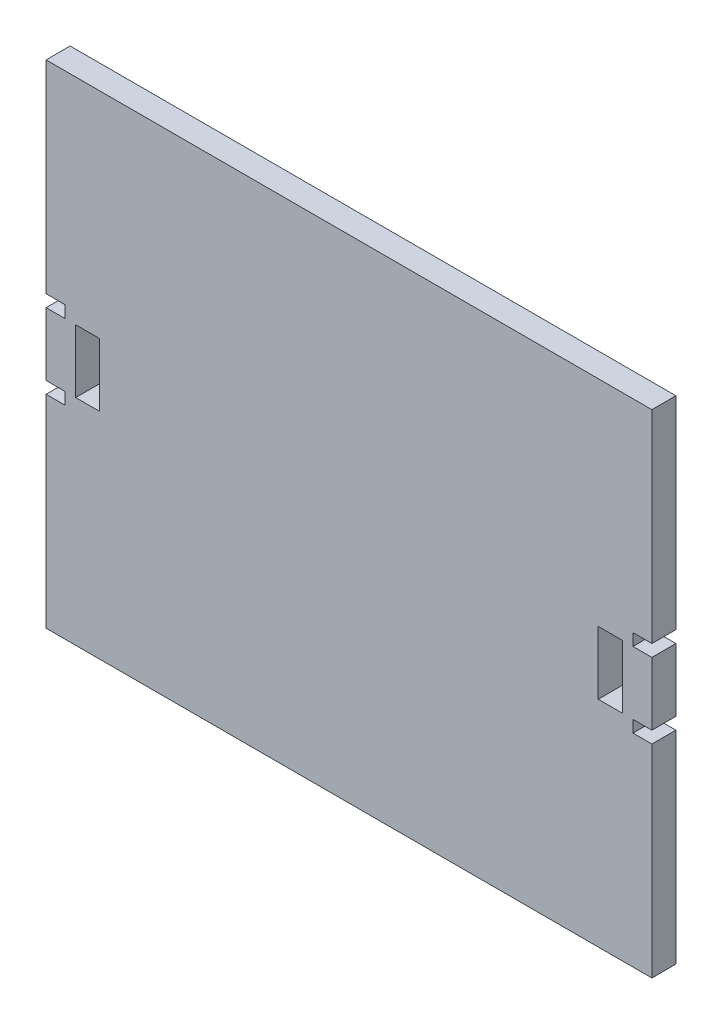
ISO-10303-21;
HEADER;
FILE_DESCRIPTION(('STEP AP214'),'2;1');
FILE_NAME('part.step','',(''),(''),'','','');
FILE_SCHEMA(('AUTOMOTIVE_DESIGN { 1 0 10303 214 1 1 1 1 }'));
ENDSEC;
DATA;
#1=APPLICATION_CONTEXT('core data for automotive mechanical design processes');
#2=APPLICATION_PROTOCOL_DEFINITION('international standard','automotive_design',2000,#1);
#3=PRODUCT_CONTEXT('',#1,'mechanical');
#4=PRODUCT('Part','Part','',(#3));
#5=PRODUCT_RELATED_PRODUCT_CATEGORY('part','',(#4));
#6=PRODUCT_DEFINITION_FORMATION('','',#4);
#7=PRODUCT_DEFINITION_CONTEXT('part definition',#1,'design');
#8=PRODUCT_DEFINITION('design','',#6,#7);
#9=PRODUCT_DEFINITION_SHAPE('','',#8);
#10=(LENGTH_UNIT() NAMED_UNIT(*) SI_UNIT(.MILLI.,.METRE.));
#11=(NAMED_UNIT(*) PLANE_ANGLE_UNIT() SI_UNIT($,.RADIAN.));
#12=(NAMED_UNIT(*) SI_UNIT($,.STERADIAN.) SOLID_ANGLE_UNIT());
#13=UNCERTAINTY_MEASURE_WITH_UNIT(LENGTH_MEASURE(1.E-05),#10,'distance_accuracy_value','');
#14=(GEOMETRIC_REPRESENTATION_CONTEXT(3) GLOBAL_UNCERTAINTY_ASSIGNED_CONTEXT((#13)) GLOBAL_UNIT_ASSIGNED_CONTEXT((#10,
#11,#12)) REPRESENTATION_CONTEXT('',''));
#15=CARTESIAN_POINT('',(0.,0.,0.));
#16=DIRECTION('',(0.,0.,1.));
#17=DIRECTION('',(1.,0.,0.));
#18=AXIS2_PLACEMENT_3D('',#15,#16,#17);
#19=CARTESIAN_POINT('',(0.,0.,6.35));
#20=DIRECTION('',(0.,0.,1.));
#21=DIRECTION('',(1.,0.,0.));
#22=AXIS2_PLACEMENT_3D('',#19,#20,#21);
#23=PLANE('',#22);
#24=DIRECTION('',(-1.,0.,0.));
#25=VECTOR('',#24,1.);
#26=CARTESIAN_POINT('',(-80.,130.,6.35));
#27=LINE('',#26,#25);
#28=CARTESIAN_POINT('',(80.,130.,6.35));
#29=VERTEX_POINT('',#28);
#30=CARTESIAN_POINT('',(-80.,130.,6.35));
#31=VERTEX_POINT('',#30);
#32=EDGE_CURVE('E285',#29,#31,#27,.T.);
#33=ORIENTED_EDGE('',*,*,#32,.T.);
#34=DIRECTION('',(0.,-1.,0.));
#35=VECTOR('',#34,1.);
#36=CARTESIAN_POINT('',(-80.,76.505,6.35));
#37=LINE('',#36,#35);
#38=CARTESIAN_POINT('',(-80.,76.505,6.35));
#39=VERTEX_POINT('',#38);
#40=EDGE_CURVE('E288',#31,#39,#37,.T.);
#41=ORIENTED_EDGE('',*,*,#40,.T.);
#42=DIRECTION('',(1.,0.,0.));
#43=VECTOR('',#42,1.);
#44=CARTESIAN_POINT('',(-80.,76.505,6.35));
#45=LINE('',#44,#43);
#46=CARTESIAN_POINT('',(-75.,76.505,6.35));
#47=VERTEX_POINT('',#46);
#48=EDGE_CURVE('E291',#39,#47,#45,.T.);
#49=ORIENTED_EDGE('',*,*,#48,.T.);
#50=DIRECTION('',(0.,-1.,0.));
#51=VECTOR('',#50,1.);
#52=CARTESIAN_POINT('',(-75.,76.505,6.35));
#53=LINE('',#52,#51);
#54=CARTESIAN_POINT('',(-75.,73.33,6.35));
#55=VERTEX_POINT('',#54);
#56=EDGE_CURVE('E293',#47,#55,#53,.T.);
#57=ORIENTED_EDGE('',*,*,#56,.T.);
#58=DIRECTION('',(-1.,0.,0.));
#59=VECTOR('',#58,1.);
#60=CARTESIAN_POINT('',(-75.,73.33,6.35));
#61=LINE('',#60,#59);
#62=CARTESIAN_POINT('',(-80.,73.33,6.35));
#63=VERTEX_POINT('',#62);
#64=EDGE_CURVE('E295',#55,#63,#61,.T.);
#65=ORIENTED_EDGE('',*,*,#64,.T.);
#66=DIRECTION('',(0.,-1.,0.));
#67=VECTOR('',#66,1.);
#68=CARTESIAN_POINT('',(-80.,56.67,6.35));
#69=LINE('',#68,#67);
#70=CARTESIAN_POINT('',(-80.,56.67,6.35));
#71=VERTEX_POINT('',#70);
#72=EDGE_CURVE('E297',#63,#71,#69,.T.);
#73=ORIENTED_EDGE('',*,*,#72,.T.);
#74=DIRECTION('',(1.,0.,0.));
#75=VECTOR('',#74,1.);
#76=CARTESIAN_POINT('',(-80.,56.67,6.35));
#77=LINE('',#76,#75);
#78=CARTESIAN_POINT('',(-75.,56.67,6.35));
#79=VERTEX_POINT('',#78);
#80=EDGE_CURVE('E299',#71,#79,#77,.T.);
#81=ORIENTED_EDGE('',*,*,#80,.T.);
#82=DIRECTION('',(0.,-1.,0.));
#83=VECTOR('',#82,1.);
#84=CARTESIAN_POINT('',(-75.,56.67,6.35));
#85=LINE('',#84,#83);
#86=CARTESIAN_POINT('',(-75.,53.52,6.35));
#87=VERTEX_POINT('',#86);
#88=EDGE_CURVE('E301',#79,#87,#85,.T.);
#89=ORIENTED_EDGE('',*,*,#88,.T.);
#90=DIRECTION('',(-1.,0.,0.));
#91=VECTOR('',#90,1.);
#92=CARTESIAN_POINT('',(-75.,53.52,6.35));
#93=LINE('',#92,#91);
#94=CARTESIAN_POINT('',(-80.,53.52,6.35));
#95=VERTEX_POINT('',#94);
#96=EDGE_CURVE('E303',#87,#95,#93,.T.);
#97=ORIENTED_EDGE('',*,*,#96,.T.);
#98=DIRECTION('',(0.,-1.,0.));
#99=VECTOR('',#98,1.);
#100=CARTESIAN_POINT('',(-80.,0.,6.35));
#101=LINE('',#100,#99);
#102=CARTESIAN_POINT('',(-80.,0.,6.35));
#103=VERTEX_POINT('',#102);
#104=EDGE_CURVE('E305',#95,#103,#101,.T.);
#105=ORIENTED_EDGE('',*,*,#104,.T.);
#106=DIRECTION('',(1.,0.,0.));
#107=VECTOR('',#106,1.);
#108=CARTESIAN_POINT('',(-80.,0.,6.35));
#109=LINE('',#108,#107);
#110=CARTESIAN_POINT('',(80.,0.,6.35));
#111=VERTEX_POINT('',#110);
#112=EDGE_CURVE('E307',#103,#111,#109,.T.);
#113=ORIENTED_EDGE('',*,*,#112,.T.);
#114=DIRECTION('',(0.,1.,0.));
#115=VECTOR('',#114,1.);
#116=CARTESIAN_POINT('',(80.,0.,6.35));
#117=LINE('',#116,#115);
#118=CARTESIAN_POINT('',(80.,53.52,6.35));
#119=VERTEX_POINT('',#118);
#120=EDGE_CURVE('E309',#111,#119,#117,.T.);
#121=ORIENTED_EDGE('',*,*,#120,.T.);
#122=DIRECTION('',(-1.,0.,0.));
#123=VECTOR('',#122,1.);
#124=CARTESIAN_POINT('',(75.,53.52,6.35));
#125=LINE('',#124,#123);
#126=CARTESIAN_POINT('',(75.,53.52,6.35));
#127=VERTEX_POINT('',#126);
#128=EDGE_CURVE('E311',#119,#127,#125,.T.);
#129=ORIENTED_EDGE('',*,*,#128,.T.);
#130=DIRECTION('',(0.,1.,0.));
#131=VECTOR('',#130,1.);
#132=CARTESIAN_POINT('',(75.,56.67,6.35));
#133=LINE('',#132,#131);
#134=CARTESIAN_POINT('',(75.,56.67,6.35));
#135=VERTEX_POINT('',#134);
#136=EDGE_CURVE('E313',#127,#135,#133,.T.);
#137=ORIENTED_EDGE('',*,*,#136,.T.);
#138=DIRECTION('',(1.,0.,0.));
#139=VECTOR('',#138,1.);
#140=CARTESIAN_POINT('',(80.,56.67,6.35));
#141=LINE('',#140,#139);
#142=CARTESIAN_POINT('',(80.,56.67,6.35));
#143=VERTEX_POINT('',#142);
#144=EDGE_CURVE('E315',#135,#143,#141,.T.);
#145=ORIENTED_EDGE('',*,*,#144,.T.);
#146=DIRECTION('',(0.,1.,0.));
#147=VECTOR('',#146,1.);
#148=CARTESIAN_POINT('',(80.,56.67,6.35));
#149=LINE('',#148,#147);
#150=CARTESIAN_POINT('',(80.,73.33,6.35));
#151=VERTEX_POINT('',#150);
#152=EDGE_CURVE('E317',#143,#151,#149,.T.);
#153=ORIENTED_EDGE('',*,*,#152,.T.);
#154=DIRECTION('',(-1.,0.,0.));
#155=VECTOR('',#154,1.);
#156=CARTESIAN_POINT('',(75.,73.33,6.35));
#157=LINE('',#156,#155);
#158=CARTESIAN_POINT('',(75.,73.33,6.35));
#159=VERTEX_POINT('',#158);
#160=EDGE_CURVE('E319',#151,#159,#157,.T.);
#161=ORIENTED_EDGE('',*,*,#160,.T.);
#162=DIRECTION('',(0.,1.,0.));
#163=VECTOR('',#162,1.);
#164=CARTESIAN_POINT('',(75.,76.505,6.35));
#165=LINE('',#164,#163);
#166=CARTESIAN_POINT('',(75.,76.505,6.35));
#167=VERTEX_POINT('',#166);
#168=EDGE_CURVE('E321',#159,#167,#165,.T.);
#169=ORIENTED_EDGE('',*,*,#168,.T.);
#170=DIRECTION('',(1.,0.,0.));
#171=VECTOR('',#170,1.);
#172=CARTESIAN_POINT('',(80.,76.505,6.35));
#173=LINE('',#172,#171);
#174=CARTESIAN_POINT('',(80.,76.505,6.35));
#175=VERTEX_POINT('',#174);
#176=EDGE_CURVE('E323',#167,#175,#173,.T.);
#177=ORIENTED_EDGE('',*,*,#176,.T.);
#178=DIRECTION('',(0.,1.,0.));
#179=VECTOR('',#178,1.);
#180=CARTESIAN_POINT('',(80.,76.505,6.35));
#181=LINE('',#180,#179);
#182=EDGE_CURVE('E325',#175,#29,#181,.T.);
#183=ORIENTED_EDGE('',*,*,#182,.T.);
#184=EDGE_LOOP('',(#33,#41,#49,#57,#65,#73,#81,#89,#97,#105,#113,#121,#129,#137,#145,#153,#161,
#169,#177,#183));
#185=FACE_BOUND('',#184,.T.);
#186=DIRECTION('',(0.,-1.,0.));
#187=VECTOR('',#186,1.);
#188=CARTESIAN_POINT('',(-72.1750000000001,73.33,6.35));
#189=LINE('',#188,#187);
#190=CARTESIAN_POINT('',(-72.1750000000001,73.33,6.35));
#191=VERTEX_POINT('',#190);
#192=CARTESIAN_POINT('',(-72.1750000000001,56.67,6.35));
#193=VERTEX_POINT('',#192);
#194=EDGE_CURVE('E256',#191,#193,#189,.T.);
#195=ORIENTED_EDGE('',*,*,#194,.F.);
#196=DIRECTION('',(-1.,0.,0.));
#197=VECTOR('',#196,1.);
#198=CARTESIAN_POINT('',(-65.8250000000001,73.33,6.35));
#199=LINE('',#198,#197);
#200=CARTESIAN_POINT('',(-65.8250000000001,73.33,6.35));
#201=VERTEX_POINT('',#200);
#202=EDGE_CURVE('E254',#201,#191,#199,.T.);
#203=ORIENTED_EDGE('',*,*,#202,.F.);
#204=DIRECTION('',(0.,1.,0.));
#205=VECTOR('',#204,1.);
#206=CARTESIAN_POINT('',(-65.8250000000001,73.33,6.35));
#207=LINE('',#206,#205);
#208=CARTESIAN_POINT('',(-65.8250000000001,56.67,6.35));
#209=VERTEX_POINT('',#208);
#210=EDGE_CURVE('E262',#209,#201,#207,.T.);
#211=ORIENTED_EDGE('',*,*,#210,.F.);
#212=DIRECTION('',(1.,0.,0.));
#213=VECTOR('',#212,1.);
#214=CARTESIAN_POINT('',(-65.8250000000001,56.67,6.35));
#215=LINE('',#214,#213);
#216=EDGE_CURVE('E259',#193,#209,#215,.T.);
#217=ORIENTED_EDGE('',*,*,#216,.F.);
#218=EDGE_LOOP('',(#195,#203,#211,#217));
#219=FACE_BOUND('',#218,.T.);
#220=DIRECTION('',(1.,0.,0.));
#221=VECTOR('',#220,1.);
#222=CARTESIAN_POINT('',(65.8250000000001,56.67,6.35));
#223=LINE('',#222,#221);
#224=CARTESIAN_POINT('',(65.8250000000001,56.67,6.35));
#225=VERTEX_POINT('',#224);
#226=CARTESIAN_POINT('',(72.1750000000001,56.67,6.35));
#227=VERTEX_POINT('',#226);
#228=EDGE_CURVE('E226',#225,#227,#223,.T.);
#229=ORIENTED_EDGE('',*,*,#228,.F.);
#230=DIRECTION('',(0.,-1.,0.));
#231=VECTOR('',#230,1.);
#232=CARTESIAN_POINT('',(65.8250000000001,73.33,6.35));
#233=LINE('',#232,#231);
#234=CARTESIAN_POINT('',(65.8250000000001,73.33,6.35));
#235=VERTEX_POINT('',#234);
#236=EDGE_CURVE('E218',#235,#225,#233,.T.);
#237=ORIENTED_EDGE('',*,*,#236,.F.);
#238=DIRECTION('',(-1.,0.,0.));
#239=VECTOR('',#238,1.);
#240=CARTESIAN_POINT('',(65.8250000000001,73.33,6.35));
#241=LINE('',#240,#239);
#242=CARTESIAN_POINT('',(72.1750000000001,73.33,6.35));
#243=VERTEX_POINT('',#242);
#244=EDGE_CURVE('E240',#243,#235,#241,.T.);
#245=ORIENTED_EDGE('',*,*,#244,.F.);
#246=DIRECTION('',(0.,1.,0.));
#247=VECTOR('',#246,1.);
#248=CARTESIAN_POINT('',(72.1750000000001,73.33,6.35));
#249=LINE('',#248,#247);
#250=EDGE_CURVE('E238',#227,#243,#249,.T.);
#251=ORIENTED_EDGE('',*,*,#250,.F.);
#252=EDGE_LOOP('',(#229,#237,#245,#251));
#253=FACE_BOUND('',#252,.T.);
#254=ADVANCED_FACE('F33',(#185,#219,#253),#23,.T.);
#255=CARTESIAN_POINT('',(0.,0.,0.));
#256=DIRECTION('',(0.,0.,1.));
#257=DIRECTION('',(1.,0.,0.));
#258=AXIS2_PLACEMENT_3D('',#255,#256,#257);
#259=PLANE('',#258);
#260=DIRECTION('',(-1.,0.,0.));
#261=VECTOR('',#260,1.);
#262=CARTESIAN_POINT('',(-65.8250000000001,73.33,0.));
#263=LINE('',#262,#261);
#264=CARTESIAN_POINT('',(-65.8250000000001,73.33,0.));
#265=VERTEX_POINT('',#264);
#266=CARTESIAN_POINT('',(-72.1750000000001,73.33,0.));
#267=VERTEX_POINT('',#266);
#268=EDGE_CURVE('E234',#265,#267,#263,.T.);
#269=ORIENTED_EDGE('',*,*,#268,.T.);
#270=DIRECTION('',(0.,-1.,0.));
#271=VECTOR('',#270,1.);
#272=CARTESIAN_POINT('',(-72.1750000000001,73.33,0.));
#273=LINE('',#272,#271);
#274=CARTESIAN_POINT('',(-72.1750000000001,56.67,0.));
#275=VERTEX_POINT('',#274);
#276=EDGE_CURVE('E267',#267,#275,#273,.T.);
#277=ORIENTED_EDGE('',*,*,#276,.T.);
#278=DIRECTION('',(1.,0.,0.));
#279=VECTOR('',#278,1.);
#280=CARTESIAN_POINT('',(-65.8250000000001,56.67,0.));
#281=LINE('',#280,#279);
#282=CARTESIAN_POINT('',(-65.8250000000001,56.67,0.));
#283=VERTEX_POINT('',#282);
#284=EDGE_CURVE('E270',#275,#283,#281,.T.);
#285=ORIENTED_EDGE('',*,*,#284,.T.);
#286=DIRECTION('',(0.,1.,0.));
#287=VECTOR('',#286,1.);
#288=CARTESIAN_POINT('',(-65.8250000000001,73.33,0.));
#289=LINE('',#288,#287);
#290=EDGE_CURVE('E257',#283,#265,#289,.T.);
#291=ORIENTED_EDGE('',*,*,#290,.T.);
#292=EDGE_LOOP('',(#269,#277,#285,#291));
#293=FACE_BOUND('',#292,.T.);
#294=DIRECTION('',(-1.,0.,0.));
#295=VECTOR('',#294,1.);
#296=CARTESIAN_POINT('',(-80.,130.,0.));
#297=LINE('',#296,#295);
#298=CARTESIAN_POINT('',(80.,130.,0.));
#299=VERTEX_POINT('',#298);
#300=CARTESIAN_POINT('',(-80.,130.,0.));
#301=VERTEX_POINT('',#300);
#302=EDGE_CURVE('E284',#299,#301,#297,.T.);
#303=ORIENTED_EDGE('',*,*,#302,.F.);
#304=DIRECTION('',(0.,1.,0.));
#305=VECTOR('',#304,1.);
#306=CARTESIAN_POINT('',(80.,76.505,0.));
#307=LINE('',#306,#305);
#308=CARTESIAN_POINT('',(80.,76.505,0.));
#309=VERTEX_POINT('',#308);
#310=EDGE_CURVE('E289',#309,#299,#307,.T.);
#311=ORIENTED_EDGE('',*,*,#310,.F.);
#312=DIRECTION('',(1.,0.,0.));
#313=VECTOR('',#312,1.);
#314=CARTESIAN_POINT('',(80.,76.505,0.));
#315=LINE('',#314,#313);
#316=CARTESIAN_POINT('',(75.,76.505,0.));
#317=VERTEX_POINT('',#316);
#318=EDGE_CURVE('E364',#317,#309,#315,.T.);
#319=ORIENTED_EDGE('',*,*,#318,.F.);
#320=DIRECTION('',(0.,1.,0.));
#321=VECTOR('',#320,1.);
#322=CARTESIAN_POINT('',(75.,76.505,0.));
#323=LINE('',#322,#321);
#324=CARTESIAN_POINT('',(75.,73.33,0.));
#325=VERTEX_POINT('',#324);
#326=EDGE_CURVE('E362',#325,#317,#323,.T.);
#327=ORIENTED_EDGE('',*,*,#326,.F.);
#328=DIRECTION('',(-1.,0.,0.));
#329=VECTOR('',#328,1.);
#330=CARTESIAN_POINT('',(75.,73.33,0.));
#331=LINE('',#330,#329);
#332=CARTESIAN_POINT('',(80.,73.33,0.));
#333=VERTEX_POINT('',#332);
#334=EDGE_CURVE('E360',#333,#325,#331,.T.);
#335=ORIENTED_EDGE('',*,*,#334,.F.);
#336=DIRECTION('',(0.,1.,0.));
#337=VECTOR('',#336,1.);
#338=CARTESIAN_POINT('',(80.,56.67,0.));
#339=LINE('',#338,#337);
#340=CARTESIAN_POINT('',(80.,56.67,0.));
#341=VERTEX_POINT('',#340);
#342=EDGE_CURVE('E358',#341,#333,#339,.T.);
#343=ORIENTED_EDGE('',*,*,#342,.F.);
#344=DIRECTION('',(1.,0.,0.));
#345=VECTOR('',#344,1.);
#346=CARTESIAN_POINT('',(80.,56.67,0.));
#347=LINE('',#346,#345);
#348=CARTESIAN_POINT('',(75.,56.67,0.));
#349=VERTEX_POINT('',#348);
#350=EDGE_CURVE('E356',#349,#341,#347,.T.);
#351=ORIENTED_EDGE('',*,*,#350,.F.);
#352=DIRECTION('',(0.,1.,0.));
#353=VECTOR('',#352,1.);
#354=CARTESIAN_POINT('',(75.,56.67,0.));
#355=LINE('',#354,#353);
#356=CARTESIAN_POINT('',(75.,53.52,0.));
#357=VERTEX_POINT('',#356);
#358=EDGE_CURVE('E354',#357,#349,#355,.T.);
#359=ORIENTED_EDGE('',*,*,#358,.F.);
#360=DIRECTION('',(-1.,0.,0.));
#361=VECTOR('',#360,1.);
#362=CARTESIAN_POINT('',(75.,53.52,0.));
#363=LINE('',#362,#361);
#364=CARTESIAN_POINT('',(80.,53.52,0.));
#365=VERTEX_POINT('',#364);
#366=EDGE_CURVE('E352',#365,#357,#363,.T.);
#367=ORIENTED_EDGE('',*,*,#366,.F.);
#368=DIRECTION('',(0.,1.,0.));
#369=VECTOR('',#368,1.);
#370=CARTESIAN_POINT('',(80.,0.,0.));
#371=LINE('',#370,#369);
#372=CARTESIAN_POINT('',(80.,0.,0.));
#373=VERTEX_POINT('',#372);
#374=EDGE_CURVE('E350',#373,#365,#371,.T.);
#375=ORIENTED_EDGE('',*,*,#374,.F.);
#376=DIRECTION('',(1.,0.,0.));
#377=VECTOR('',#376,1.);
#378=CARTESIAN_POINT('',(-80.,0.,0.));
#379=LINE('',#378,#377);
#380=CARTESIAN_POINT('',(-80.,0.,0.));
#381=VERTEX_POINT('',#380);
#382=EDGE_CURVE('E348',#381,#373,#379,.T.);
#383=ORIENTED_EDGE('',*,*,#382,.F.);
#384=DIRECTION('',(0.,-1.,0.));
#385=VECTOR('',#384,1.);
#386=CARTESIAN_POINT('',(-80.,0.,0.));
#387=LINE('',#386,#385);
#388=CARTESIAN_POINT('',(-80.,53.52,0.));
#389=VERTEX_POINT('',#388);
#390=EDGE_CURVE('E346',#389,#381,#387,.T.);
#391=ORIENTED_EDGE('',*,*,#390,.F.);
#392=DIRECTION('',(-1.,0.,0.));
#393=VECTOR('',#392,1.);
#394=CARTESIAN_POINT('',(-75.,53.52,0.));
#395=LINE('',#394,#393);
#396=CARTESIAN_POINT('',(-75.,53.52,0.));
#397=VERTEX_POINT('',#396);
#398=EDGE_CURVE('E344',#397,#389,#395,.T.);
#399=ORIENTED_EDGE('',*,*,#398,.F.);
#400=DIRECTION('',(0.,-1.,0.));
#401=VECTOR('',#400,1.);
#402=CARTESIAN_POINT('',(-75.,56.67,0.));
#403=LINE('',#402,#401);
#404=CARTESIAN_POINT('',(-75.,56.67,0.));
#405=VERTEX_POINT('',#404);
#406=EDGE_CURVE('E342',#405,#397,#403,.T.);
#407=ORIENTED_EDGE('',*,*,#406,.F.);
#408=DIRECTION('',(1.,0.,0.));
#409=VECTOR('',#408,1.);
#410=CARTESIAN_POINT('',(-80.,56.67,0.));
#411=LINE('',#410,#409);
#412=CARTESIAN_POINT('',(-80.,56.67,0.));
#413=VERTEX_POINT('',#412);
#414=EDGE_CURVE('E340',#413,#405,#411,.T.);
#415=ORIENTED_EDGE('',*,*,#414,.F.);
#416=DIRECTION('',(0.,-1.,0.));
#417=VECTOR('',#416,1.);
#418=CARTESIAN_POINT('',(-80.,56.67,0.));
#419=LINE('',#418,#417);
#420=CARTESIAN_POINT('',(-80.,73.33,0.));
#421=VERTEX_POINT('',#420);
#422=EDGE_CURVE('E338',#421,#413,#419,.T.);
#423=ORIENTED_EDGE('',*,*,#422,.F.);
#424=DIRECTION('',(-1.,0.,0.));
#425=VECTOR('',#424,1.);
#426=CARTESIAN_POINT('',(-75.,73.33,0.));
#427=LINE('',#426,#425);
#428=CARTESIAN_POINT('',(-75.,73.33,0.));
#429=VERTEX_POINT('',#428);
#430=EDGE_CURVE('E336',#429,#421,#427,.T.);
#431=ORIENTED_EDGE('',*,*,#430,.F.);
#432=DIRECTION('',(0.,-1.,0.));
#433=VECTOR('',#432,1.);
#434=CARTESIAN_POINT('',(-75.,76.505,0.));
#435=LINE('',#434,#433);
#436=CARTESIAN_POINT('',(-75.,76.505,0.));
#437=VERTEX_POINT('',#436);
#438=EDGE_CURVE('E334',#437,#429,#435,.T.);
#439=ORIENTED_EDGE('',*,*,#438,.F.);
#440=DIRECTION('',(1.,0.,0.));
#441=VECTOR('',#440,1.);
#442=CARTESIAN_POINT('',(-80.,76.505,0.));
#443=LINE('',#442,#441);
#444=CARTESIAN_POINT('',(-80.,76.505,0.));
#445=VERTEX_POINT('',#444);
#446=EDGE_CURVE('E332',#445,#437,#443,.T.);
#447=ORIENTED_EDGE('',*,*,#446,.F.);
#448=DIRECTION('',(0.,-1.,0.));
#449=VECTOR('',#448,1.);
#450=CARTESIAN_POINT('',(-80.,76.505,0.));
#451=LINE('',#450,#449);
#452=EDGE_CURVE('E330',#301,#445,#451,.T.);
#453=ORIENTED_EDGE('',*,*,#452,.F.);
#454=EDGE_LOOP('',(#303,#311,#319,#327,#335,#343,#351,#359,#367,#375,#383,#391,#399,#407,#415,
#423,#431,#439,#447,#453));
#455=FACE_BOUND('',#454,.T.);
#456=DIRECTION('',(0.,-1.,0.));
#457=VECTOR('',#456,1.);
#458=CARTESIAN_POINT('',(65.8250000000001,73.33,0.));
#459=LINE('',#458,#457);
#460=CARTESIAN_POINT('',(65.8250000000001,73.33,0.));
#461=VERTEX_POINT('',#460);
#462=CARTESIAN_POINT('',(65.8250000000001,56.67,0.));
#463=VERTEX_POINT('',#462);
#464=EDGE_CURVE('E56',#461,#463,#459,.T.);
#465=ORIENTED_EDGE('',*,*,#464,.T.);
#466=DIRECTION('',(1.,0.,0.));
#467=VECTOR('',#466,1.);
#468=CARTESIAN_POINT('',(65.8250000000001,56.67,0.));
#469=LINE('',#468,#467);
#470=CARTESIAN_POINT('',(72.1750000000001,56.67,0.));
#471=VERTEX_POINT('',#470);
#472=EDGE_CURVE('E233',#463,#471,#469,.T.);
#473=ORIENTED_EDGE('',*,*,#472,.T.);
#474=DIRECTION('',(0.,1.,0.));
#475=VECTOR('',#474,1.);
#476=CARTESIAN_POINT('',(72.1750000000001,73.33,0.));
#477=LINE('',#476,#475);
#478=CARTESIAN_POINT('',(72.1750000000001,73.33,0.));
#479=VERTEX_POINT('',#478);
#480=EDGE_CURVE('E246',#471,#479,#477,.T.);
#481=ORIENTED_EDGE('',*,*,#480,.T.);
#482=DIRECTION('',(-1.,0.,0.));
#483=VECTOR('',#482,1.);
#484=CARTESIAN_POINT('',(65.8250000000001,73.33,0.));
#485=LINE('',#484,#483);
#486=EDGE_CURVE('E227',#479,#461,#485,.T.);
#487=ORIENTED_EDGE('',*,*,#486,.T.);
#488=EDGE_LOOP('',(#465,#473,#481,#487));
#489=FACE_BOUND('',#488,.T.);
#490=ADVANCED_FACE('F430',(#293,#455,#489),#259,.F.);
#491=CARTESIAN_POINT('',(-80.,130.,6.35));
#492=DIRECTION('',(0.,-1.,0.));
#493=DIRECTION('',(0.,0.,-1.));
#494=AXIS2_PLACEMENT_3D('',#491,#492,#493);
#495=PLANE('',#494);
#496=ORIENTED_EDGE('',*,*,#302,.T.);
#497=DIRECTION('',(0.,0.,-1.));
#498=VECTOR('',#497,1.);
#499=CARTESIAN_POINT('',(-80.,130.,6.35));
#500=LINE('',#499,#498);
#501=EDGE_CURVE('E11',#31,#301,#500,.T.);
#502=ORIENTED_EDGE('',*,*,#501,.F.);
#503=ORIENTED_EDGE('',*,*,#32,.F.);
#504=DIRECTION('',(0.,0.,-1.));
#505=VECTOR('',#504,1.);
#506=CARTESIAN_POINT('',(80.,130.,6.35));
#507=LINE('',#506,#505);
#508=EDGE_CURVE('E327',#29,#299,#507,.T.);
#509=ORIENTED_EDGE('',*,*,#508,.T.);
#510=EDGE_LOOP('',(#496,#502,#503,#509));
#511=FACE_BOUND('',#510,.T.);
#512=ADVANCED_FACE('F35',(#511),#495,.F.);
#513=CARTESIAN_POINT('',(-80.,76.505,6.35));
#514=DIRECTION('',(1.,0.,0.));
#515=DIRECTION('',(0.,0.,-1.));
#516=AXIS2_PLACEMENT_3D('',#513,#514,#515);
#517=PLANE('',#516);
#518=ORIENTED_EDGE('',*,*,#452,.T.);
#519=DIRECTION('',(0.,0.,-1.));
#520=VECTOR('',#519,1.);
#521=CARTESIAN_POINT('',(-80.,76.505,6.35));
#522=LINE('',#521,#520);
#523=EDGE_CURVE('E41',#39,#445,#522,.T.);
#524=ORIENTED_EDGE('',*,*,#523,.F.);
#525=ORIENTED_EDGE('',*,*,#40,.F.);
#526=ORIENTED_EDGE('',*,*,#501,.T.);
#527=EDGE_LOOP('',(#518,#524,#525,#526));
#528=FACE_BOUND('',#527,.T.);
#529=ADVANCED_FACE('F448',(#528),#517,.F.);
#530=CARTESIAN_POINT('',(-80.,76.505,6.35));
#531=DIRECTION('',(0.,1.,0.));
#532=DIRECTION('',(-1.,0.,0.));
#533=AXIS2_PLACEMENT_3D('',#530,#531,#532);
#534=PLANE('',#533);
#535=ORIENTED_EDGE('',*,*,#446,.T.);
#536=DIRECTION('',(0.,0.,-1.));
#537=VECTOR('',#536,1.);
#538=CARTESIAN_POINT('',(-75.,76.505,6.35));
#539=LINE('',#538,#537);
#540=EDGE_CURVE('E417',#47,#437,#539,.T.);
#541=ORIENTED_EDGE('',*,*,#540,.F.);
#542=ORIENTED_EDGE('',*,*,#48,.F.);
#543=ORIENTED_EDGE('',*,*,#523,.T.);
#544=EDGE_LOOP('',(#535,#541,#542,#543));
#545=FACE_BOUND('',#544,.T.);
#546=ADVANCED_FACE('F424',(#545),#534,.F.);
#547=CARTESIAN_POINT('',(-75.,76.505,6.35));
#548=DIRECTION('',(1.,0.,0.));
#549=DIRECTION('',(0.,0.,-1.));
#550=AXIS2_PLACEMENT_3D('',#547,#548,#549);
#551=PLANE('',#550);
#552=ORIENTED_EDGE('',*,*,#438,.T.);
#553=DIRECTION('',(0.,0.,-1.));
#554=VECTOR('',#553,1.);
#555=CARTESIAN_POINT('',(-75.,73.33,6.35));
#556=LINE('',#555,#554);
#557=EDGE_CURVE('E414',#55,#429,#556,.T.);
#558=ORIENTED_EDGE('',*,*,#557,.F.);
#559=ORIENTED_EDGE('',*,*,#56,.F.);
#560=ORIENTED_EDGE('',*,*,#540,.T.);
#561=EDGE_LOOP('',(#552,#558,#559,#560));
#562=FACE_BOUND('',#561,.T.);
#563=ADVANCED_FACE('F436',(#562),#551,.F.);
#564=CARTESIAN_POINT('',(-75.,73.33,6.35));
#565=DIRECTION('',(0.,-1.,0.));
#566=DIRECTION('',(0.,0.,-1.));
#567=AXIS2_PLACEMENT_3D('',#564,#565,#566);
#568=PLANE('',#567);
#569=ORIENTED_EDGE('',*,*,#430,.T.);
#570=DIRECTION('',(0.,0.,-1.));
#571=VECTOR('',#570,1.);
#572=CARTESIAN_POINT('',(-80.,73.33,6.35));
#573=LINE('',#572,#571);
#574=EDGE_CURVE('E411',#63,#421,#573,.T.);
#575=ORIENTED_EDGE('',*,*,#574,.F.);
#576=ORIENTED_EDGE('',*,*,#64,.F.);
#577=ORIENTED_EDGE('',*,*,#557,.T.);
#578=EDGE_LOOP('',(#569,#575,#576,#577));
#579=FACE_BOUND('',#578,.T.);
#580=ADVANCED_FACE('F440',(#579),#568,.F.);
#581=CARTESIAN_POINT('',(-80.,56.67,6.35));
#582=DIRECTION('',(1.,0.,0.));
#583=DIRECTION('',(0.,0.,-1.));
#584=AXIS2_PLACEMENT_3D('',#581,#582,#583);
#585=PLANE('',#584);
#586=ORIENTED_EDGE('',*,*,#422,.T.);
#587=DIRECTION('',(0.,0.,-1.));
#588=VECTOR('',#587,1.);
#589=CARTESIAN_POINT('',(-80.,56.67,6.35));
#590=LINE('',#589,#588);
#591=EDGE_CURVE('E408',#71,#413,#590,.T.);
#592=ORIENTED_EDGE('',*,*,#591,.F.);
#593=ORIENTED_EDGE('',*,*,#72,.F.);
#594=ORIENTED_EDGE('',*,*,#574,.T.);
#595=EDGE_LOOP('',(#586,#592,#593,#594));
#596=FACE_BOUND('',#595,.T.);
#597=ADVANCED_FACE('F521',(#596),#585,.F.);
#598=CARTESIAN_POINT('',(-80.,56.67,6.35));
#599=DIRECTION('',(0.,1.,0.));
#600=DIRECTION('',(0.,0.,1.));
#601=AXIS2_PLACEMENT_3D('',#598,#599,#600);
#602=PLANE('',#601);
#603=ORIENTED_EDGE('',*,*,#414,.T.);
#604=DIRECTION('',(0.,0.,-1.));
#605=VECTOR('',#604,1.);
#606=CARTESIAN_POINT('',(-75.,56.67,6.35));
#607=LINE('',#606,#605);
#608=EDGE_CURVE('E405',#79,#405,#607,.T.);
#609=ORIENTED_EDGE('',*,*,#608,.F.);
#610=ORIENTED_EDGE('',*,*,#80,.F.);
#611=ORIENTED_EDGE('',*,*,#591,.T.);
#612=EDGE_LOOP('',(#603,#609,#610,#611));
#613=FACE_BOUND('',#612,.T.);
#614=ADVANCED_FACE('F519',(#613),#602,.F.);
#615=CARTESIAN_POINT('',(-75.,56.67,6.35));
#616=DIRECTION('',(1.,0.,0.));
#617=DIRECTION('',(0.,0.,-1.));
#618=AXIS2_PLACEMENT_3D('',#615,#616,#617);
#619=PLANE('',#618);
#620=ORIENTED_EDGE('',*,*,#406,.T.);
#621=DIRECTION('',(0.,0.,-1.));
#622=VECTOR('',#621,1.);
#623=CARTESIAN_POINT('',(-75.,53.52,6.35));
#624=LINE('',#623,#622);
#625=EDGE_CURVE('E402',#87,#397,#624,.T.);
#626=ORIENTED_EDGE('',*,*,#625,.F.);
#627=ORIENTED_EDGE('',*,*,#88,.F.);
#628=ORIENTED_EDGE('',*,*,#608,.T.);
#629=EDGE_LOOP('',(#620,#626,#627,#628));
#630=FACE_BOUND('',#629,.T.);
#631=ADVANCED_FACE('F514',(#630),#619,.F.);
#632=CARTESIAN_POINT('',(-75.,53.52,6.35));
#633=DIRECTION('',(0.,-1.,0.));
#634=DIRECTION('',(1.,0.,0.));
#635=AXIS2_PLACEMENT_3D('',#632,#633,#634);
#636=PLANE('',#635);
#637=ORIENTED_EDGE('',*,*,#398,.T.);
#638=DIRECTION('',(0.,0.,-1.));
#639=VECTOR('',#638,1.);
#640=CARTESIAN_POINT('',(-80.,53.52,6.35));
#641=LINE('',#640,#639);
#642=EDGE_CURVE('E399',#95,#389,#641,.T.);
#643=ORIENTED_EDGE('',*,*,#642,.F.);
#644=ORIENTED_EDGE('',*,*,#96,.F.);
#645=ORIENTED_EDGE('',*,*,#625,.T.);
#646=EDGE_LOOP('',(#637,#643,#644,#645));
#647=FACE_BOUND('',#646,.T.);
#648=ADVANCED_FACE('F509',(#647),#636,.F.);
#649=CARTESIAN_POINT('',(-80.,0.,6.35));
#650=DIRECTION('',(1.,0.,0.));
#651=DIRECTION('',(0.,0.,-1.));
#652=AXIS2_PLACEMENT_3D('',#649,#650,#651);
#653=PLANE('',#652);
#654=ORIENTED_EDGE('',*,*,#390,.T.);
#655=DIRECTION('',(0.,0.,-1.));
#656=VECTOR('',#655,1.);
#657=CARTESIAN_POINT('',(-80.,0.,6.35));
#658=LINE('',#657,#656);
#659=EDGE_CURVE('E396',#103,#381,#658,.T.);
#660=ORIENTED_EDGE('',*,*,#659,.F.);
#661=ORIENTED_EDGE('',*,*,#104,.F.);
#662=ORIENTED_EDGE('',*,*,#642,.T.);
#663=EDGE_LOOP('',(#654,#660,#661,#662));
#664=FACE_BOUND('',#663,.T.);
#665=ADVANCED_FACE('F505',(#664),#653,.F.);
#666=CARTESIAN_POINT('',(-80.,0.,6.35));
#667=DIRECTION('',(0.,1.,0.));
#668=DIRECTION('',(0.,0.,1.));
#669=AXIS2_PLACEMENT_3D('',#666,#667,#668);
#670=PLANE('',#669);
#671=ORIENTED_EDGE('',*,*,#382,.T.);
#672=DIRECTION('',(0.,0.,-1.));
#673=VECTOR('',#672,1.);
#674=CARTESIAN_POINT('',(80.,0.,6.35));
#675=LINE('',#674,#673);
#676=EDGE_CURVE('E393',#111,#373,#675,.T.);
#677=ORIENTED_EDGE('',*,*,#676,.F.);
#678=ORIENTED_EDGE('',*,*,#112,.F.);
#679=ORIENTED_EDGE('',*,*,#659,.T.);
#680=EDGE_LOOP('',(#671,#677,#678,#679));
#681=FACE_BOUND('',#680,.T.);
#682=ADVANCED_FACE('F500',(#681),#670,.F.);
#683=CARTESIAN_POINT('',(80.,0.,6.35));
#684=DIRECTION('',(-1.,0.,0.));
#685=DIRECTION('',(0.,0.,1.));
#686=AXIS2_PLACEMENT_3D('',#683,#684,#685);
#687=PLANE('',#686);
#688=ORIENTED_EDGE('',*,*,#374,.T.);
#689=DIRECTION('',(0.,0.,-1.));
#690=VECTOR('',#689,1.);
#691=CARTESIAN_POINT('',(80.,53.52,6.35));
#692=LINE('',#691,#690);
#693=EDGE_CURVE('E390',#119,#365,#692,.T.);
#694=ORIENTED_EDGE('',*,*,#693,.F.);
#695=ORIENTED_EDGE('',*,*,#120,.F.);
#696=ORIENTED_EDGE('',*,*,#676,.T.);
#697=EDGE_LOOP('',(#688,#694,#695,#696));
#698=FACE_BOUND('',#697,.T.);
#699=ADVANCED_FACE('F494',(#698),#687,.F.);
#700=CARTESIAN_POINT('',(75.,53.52,6.35));
#701=DIRECTION('',(0.,-1.,0.));
#702=DIRECTION('',(1.,0.,0.));
#703=AXIS2_PLACEMENT_3D('',#700,#701,#702);
#704=PLANE('',#703);
#705=ORIENTED_EDGE('',*,*,#366,.T.);
#706=DIRECTION('',(0.,0.,-1.));
#707=VECTOR('',#706,1.);
#708=CARTESIAN_POINT('',(75.,53.52,6.35));
#709=LINE('',#708,#707);
#710=EDGE_CURVE('E387',#127,#357,#709,.T.);
#711=ORIENTED_EDGE('',*,*,#710,.F.);
#712=ORIENTED_EDGE('',*,*,#128,.F.);
#713=ORIENTED_EDGE('',*,*,#693,.T.);
#714=EDGE_LOOP('',(#705,#711,#712,#713));
#715=FACE_BOUND('',#714,.T.);
#716=ADVANCED_FACE('F490',(#715),#704,.F.);
#717=CARTESIAN_POINT('',(75.,56.67,6.35));
#718=DIRECTION('',(-1.,0.,0.));
#719=DIRECTION('',(0.,0.,1.));
#720=AXIS2_PLACEMENT_3D('',#717,#718,#719);
#721=PLANE('',#720);
#722=ORIENTED_EDGE('',*,*,#358,.T.);
#723=DIRECTION('',(0.,0.,-1.));
#724=VECTOR('',#723,1.);
#725=CARTESIAN_POINT('',(75.,56.67,6.35));
#726=LINE('',#725,#724);
#727=EDGE_CURVE('E384',#135,#349,#726,.T.);
#728=ORIENTED_EDGE('',*,*,#727,.F.);
#729=ORIENTED_EDGE('',*,*,#136,.F.);
#730=ORIENTED_EDGE('',*,*,#710,.T.);
#731=EDGE_LOOP('',(#722,#728,#729,#730));
#732=FACE_BOUND('',#731,.T.);
#733=ADVANCED_FACE('F485',(#732),#721,.F.);
#734=CARTESIAN_POINT('',(80.,56.67,6.35));
#735=DIRECTION('',(0.,1.,0.));
#736=DIRECTION('',(0.,0.,1.));
#737=AXIS2_PLACEMENT_3D('',#734,#735,#736);
#738=PLANE('',#737);
#739=ORIENTED_EDGE('',*,*,#350,.T.);
#740=DIRECTION('',(0.,0.,-1.));
#741=VECTOR('',#740,1.);
#742=CARTESIAN_POINT('',(80.,56.67,6.35));
#743=LINE('',#742,#741);
#744=EDGE_CURVE('E381',#143,#341,#743,.T.);
#745=ORIENTED_EDGE('',*,*,#744,.F.);
#746=ORIENTED_EDGE('',*,*,#144,.F.);
#747=ORIENTED_EDGE('',*,*,#727,.T.);
#748=EDGE_LOOP('',(#739,#745,#746,#747));
#749=FACE_BOUND('',#748,.T.);
#750=ADVANCED_FACE('F479',(#749),#738,.F.);
#751=CARTESIAN_POINT('',(80.,56.67,6.35));
#752=DIRECTION('',(-1.,0.,0.));
#753=DIRECTION('',(0.,0.,1.));
#754=AXIS2_PLACEMENT_3D('',#751,#752,#753);
#755=PLANE('',#754);
#756=ORIENTED_EDGE('',*,*,#342,.T.);
#757=DIRECTION('',(0.,0.,-1.));
#758=VECTOR('',#757,1.);
#759=CARTESIAN_POINT('',(80.,73.33,6.35));
#760=LINE('',#759,#758);
#761=EDGE_CURVE('E378',#151,#333,#760,.T.);
#762=ORIENTED_EDGE('',*,*,#761,.F.);
#763=ORIENTED_EDGE('',*,*,#152,.F.);
#764=ORIENTED_EDGE('',*,*,#744,.T.);
#765=EDGE_LOOP('',(#756,#762,#763,#764));
#766=FACE_BOUND('',#765,.T.);
#767=ADVANCED_FACE('F475',(#766),#755,.F.);
#768=CARTESIAN_POINT('',(75.,73.33,6.35));
#769=DIRECTION('',(0.,-1.,0.));
#770=DIRECTION('',(0.,0.,-1.));
#771=AXIS2_PLACEMENT_3D('',#768,#769,#770);
#772=PLANE('',#771);
#773=ORIENTED_EDGE('',*,*,#334,.T.);
#774=DIRECTION('',(0.,0.,-1.));
#775=VECTOR('',#774,1.);
#776=CARTESIAN_POINT('',(75.,73.33,6.35));
#777=LINE('',#776,#775);
#778=EDGE_CURVE('E375',#159,#325,#777,.T.);
#779=ORIENTED_EDGE('',*,*,#778,.F.);
#780=ORIENTED_EDGE('',*,*,#160,.F.);
#781=ORIENTED_EDGE('',*,*,#761,.T.);
#782=EDGE_LOOP('',(#773,#779,#780,#781));
#783=FACE_BOUND('',#782,.T.);
#784=ADVANCED_FACE('F470',(#783),#772,.F.);
#785=CARTESIAN_POINT('',(75.,76.505,6.35));
#786=DIRECTION('',(-1.,0.,0.));
#787=DIRECTION('',(0.,0.,1.));
#788=AXIS2_PLACEMENT_3D('',#785,#786,#787);
#789=PLANE('',#788);
#790=ORIENTED_EDGE('',*,*,#326,.T.);
#791=DIRECTION('',(0.,0.,-1.));
#792=VECTOR('',#791,1.);
#793=CARTESIAN_POINT('',(75.,76.505,6.35));
#794=LINE('',#793,#792);
#795=EDGE_CURVE('E372',#167,#317,#794,.T.);
#796=ORIENTED_EDGE('',*,*,#795,.F.);
#797=ORIENTED_EDGE('',*,*,#168,.F.);
#798=ORIENTED_EDGE('',*,*,#778,.T.);
#799=EDGE_LOOP('',(#790,#796,#797,#798));
#800=FACE_BOUND('',#799,.T.);
#801=ADVANCED_FACE('F464',(#800),#789,.F.);
#802=CARTESIAN_POINT('',(80.,76.505,6.35));
#803=DIRECTION('',(0.,1.,0.));
#804=DIRECTION('',(-1.,0.,0.));
#805=AXIS2_PLACEMENT_3D('',#802,#803,#804);
#806=PLANE('',#805);
#807=ORIENTED_EDGE('',*,*,#318,.T.);
#808=DIRECTION('',(0.,0.,-1.));
#809=VECTOR('',#808,1.);
#810=CARTESIAN_POINT('',(80.,76.505,6.35));
#811=LINE('',#810,#809);
#812=EDGE_CURVE('E369',#175,#309,#811,.T.);
#813=ORIENTED_EDGE('',*,*,#812,.F.);
#814=ORIENTED_EDGE('',*,*,#176,.F.);
#815=ORIENTED_EDGE('',*,*,#795,.T.);
#816=EDGE_LOOP('',(#807,#813,#814,#815));
#817=FACE_BOUND('',#816,.T.);
#818=ADVANCED_FACE('F460',(#817),#806,.F.);
#819=CARTESIAN_POINT('',(80.,76.505,6.35));
#820=DIRECTION('',(-1.,0.,0.));
#821=DIRECTION('',(0.,0.,1.));
#822=AXIS2_PLACEMENT_3D('',#819,#820,#821);
#823=PLANE('',#822);
#824=ORIENTED_EDGE('',*,*,#310,.T.);
#825=ORIENTED_EDGE('',*,*,#508,.F.);
#826=ORIENTED_EDGE('',*,*,#182,.F.);
#827=ORIENTED_EDGE('',*,*,#812,.T.);
#828=EDGE_LOOP('',(#824,#825,#826,#827));
#829=FACE_BOUND('',#828,.T.);
#830=ADVANCED_FACE('F455',(#829),#823,.F.);
#831=CARTESIAN_POINT('',(-65.8250000000001,73.33,6.35));
#832=DIRECTION('',(0.,-1.,0.));
#833=DIRECTION('',(0.,0.,-1.));
#834=AXIS2_PLACEMENT_3D('',#831,#832,#833);
#835=PLANE('',#834);
#836=ORIENTED_EDGE('',*,*,#268,.F.);
#837=DIRECTION('',(0.,0.,-1.));
#838=VECTOR('',#837,1.);
#839=CARTESIAN_POINT('',(-65.8250000000001,73.33,6.35));
#840=LINE('',#839,#838);
#841=EDGE_CURVE('E264',#201,#265,#840,.T.);
#842=ORIENTED_EDGE('',*,*,#841,.F.);
#843=ORIENTED_EDGE('',*,*,#202,.T.);
#844=DIRECTION('',(0.,0.,-1.));
#845=VECTOR('',#844,1.);
#846=CARTESIAN_POINT('',(-72.1750000000001,73.33,6.35));
#847=LINE('',#846,#845);
#848=EDGE_CURVE('E281',#191,#267,#847,.T.);
#849=ORIENTED_EDGE('',*,*,#848,.T.);
#850=EDGE_LOOP('',(#836,#842,#843,#849));
#851=FACE_BOUND('',#850,.T.);
#852=ADVANCED_FACE('F538',(#851),#835,.T.);
#853=CARTESIAN_POINT('',(-72.1750000000001,73.33,6.35));
#854=DIRECTION('',(1.,0.,0.));
#855=DIRECTION('',(0.,0.,-1.));
#856=AXIS2_PLACEMENT_3D('',#853,#854,#855);
#857=PLANE('',#856);
#858=ORIENTED_EDGE('',*,*,#276,.F.);
#859=ORIENTED_EDGE('',*,*,#848,.F.);
#860=ORIENTED_EDGE('',*,*,#194,.T.);
#861=DIRECTION('',(0.,0.,-1.));
#862=VECTOR('',#861,1.);
#863=CARTESIAN_POINT('',(-72.1750000000001,56.67,6.35));
#864=LINE('',#863,#862);
#865=EDGE_CURVE('E279',#193,#275,#864,.T.);
#866=ORIENTED_EDGE('',*,*,#865,.T.);
#867=EDGE_LOOP('',(#858,#859,#860,#866));
#868=FACE_BOUND('',#867,.T.);
#869=ADVANCED_FACE('F624',(#868),#857,.T.);
#870=CARTESIAN_POINT('',(-65.8250000000001,56.67,6.35));
#871=DIRECTION('',(0.,1.,0.));
#872=DIRECTION('',(0.,0.,1.));
#873=AXIS2_PLACEMENT_3D('',#870,#871,#872);
#874=PLANE('',#873);
#875=ORIENTED_EDGE('',*,*,#284,.F.);
#876=ORIENTED_EDGE('',*,*,#865,.F.);
#877=ORIENTED_EDGE('',*,*,#216,.T.);
#878=DIRECTION('',(0.,0.,-1.));
#879=VECTOR('',#878,1.);
#880=CARTESIAN_POINT('',(-65.8250000000001,56.67,6.35));
#881=LINE('',#880,#879);
#882=EDGE_CURVE('E277',#209,#283,#881,.T.);
#883=ORIENTED_EDGE('',*,*,#882,.T.);
#884=EDGE_LOOP('',(#875,#876,#877,#883));
#885=FACE_BOUND('',#884,.T.);
#886=ADVANCED_FACE('F631',(#885),#874,.T.);
#887=CARTESIAN_POINT('',(-65.8250000000001,73.33,6.35));
#888=DIRECTION('',(-1.,0.,0.));
#889=DIRECTION('',(0.,0.,1.));
#890=AXIS2_PLACEMENT_3D('',#887,#888,#889);
#891=PLANE('',#890);
#892=ORIENTED_EDGE('',*,*,#290,.F.);
#893=ORIENTED_EDGE('',*,*,#882,.F.);
#894=ORIENTED_EDGE('',*,*,#210,.T.);
#895=ORIENTED_EDGE('',*,*,#841,.T.);
#896=EDGE_LOOP('',(#892,#893,#894,#895));
#897=FACE_BOUND('',#896,.T.);
#898=ADVANCED_FACE('F638',(#897),#891,.T.);
#899=CARTESIAN_POINT('',(65.8250000000001,73.33,6.35));
#900=DIRECTION('',(1.,0.,0.));
#901=DIRECTION('',(0.,0.,-1.));
#902=AXIS2_PLACEMENT_3D('',#899,#900,#901);
#903=PLANE('',#902);
#904=ORIENTED_EDGE('',*,*,#464,.F.);
#905=DIRECTION('',(0.,0.,-1.));
#906=VECTOR('',#905,1.);
#907=CARTESIAN_POINT('',(65.8250000000001,73.33,6.35));
#908=LINE('',#907,#906);
#909=EDGE_CURVE('E222',#235,#461,#908,.T.);
#910=ORIENTED_EDGE('',*,*,#909,.F.);
#911=ORIENTED_EDGE('',*,*,#236,.T.);
#912=DIRECTION('',(0.,0.,-1.));
#913=VECTOR('',#912,1.);
#914=CARTESIAN_POINT('',(65.8250000000001,56.67,6.35));
#915=LINE('',#914,#913);
#916=EDGE_CURVE('E221',#225,#463,#915,.T.);
#917=ORIENTED_EDGE('',*,*,#916,.T.);
#918=EDGE_LOOP('',(#904,#910,#911,#917));
#919=FACE_BOUND('',#918,.T.);
#920=ADVANCED_FACE('F220',(#919),#903,.T.);
#921=CARTESIAN_POINT('',(65.8250000000001,56.67,6.35));
#922=DIRECTION('',(0.,1.,0.));
#923=DIRECTION('',(0.,0.,1.));
#924=AXIS2_PLACEMENT_3D('',#921,#922,#923);
#925=PLANE('',#924);
#926=ORIENTED_EDGE('',*,*,#472,.F.);
#927=ORIENTED_EDGE('',*,*,#916,.F.);
#928=ORIENTED_EDGE('',*,*,#228,.T.);
#929=DIRECTION('',(0.,0.,-1.));
#930=VECTOR('',#929,1.);
#931=CARTESIAN_POINT('',(72.1750000000001,56.67,6.35));
#932=LINE('',#931,#930);
#933=EDGE_CURVE('E235',#227,#471,#932,.T.);
#934=ORIENTED_EDGE('',*,*,#933,.T.);
#935=EDGE_LOOP('',(#926,#927,#928,#934));
#936=FACE_BOUND('',#935,.T.);
#937=ADVANCED_FACE('F230',(#936),#925,.T.);
#938=CARTESIAN_POINT('',(72.1750000000001,73.33,6.35));
#939=DIRECTION('',(-1.,0.,0.));
#940=DIRECTION('',(0.,0.,1.));
#941=AXIS2_PLACEMENT_3D('',#938,#939,#940);
#942=PLANE('',#941);
#943=ORIENTED_EDGE('',*,*,#480,.F.);
#944=ORIENTED_EDGE('',*,*,#933,.F.);
#945=ORIENTED_EDGE('',*,*,#250,.T.);
#946=DIRECTION('',(0.,0.,-1.));
#947=VECTOR('',#946,1.);
#948=CARTESIAN_POINT('',(72.1750000000001,73.33,6.35));
#949=LINE('',#948,#947);
#950=EDGE_CURVE('E48',#243,#479,#949,.T.);
#951=ORIENTED_EDGE('',*,*,#950,.T.);
#952=EDGE_LOOP('',(#943,#944,#945,#951));
#953=FACE_BOUND('',#952,.T.);
#954=ADVANCED_FACE('F659',(#953),#942,.T.);
#955=CARTESIAN_POINT('',(65.8250000000001,73.33,6.35));
#956=DIRECTION('',(0.,-1.,0.));
#957=DIRECTION('',(0.,0.,-1.));
#958=AXIS2_PLACEMENT_3D('',#955,#956,#957);
#959=PLANE('',#958);
#960=ORIENTED_EDGE('',*,*,#486,.F.);
#961=ORIENTED_EDGE('',*,*,#950,.F.);
#962=ORIENTED_EDGE('',*,*,#244,.T.);
#963=ORIENTED_EDGE('',*,*,#909,.T.);
#964=EDGE_LOOP('',(#960,#961,#962,#963));
#965=FACE_BOUND('',#964,.T.);
#966=ADVANCED_FACE('F666',(#965),#959,.T.);
#967=CLOSED_SHELL('',(#254,#490,#512,#529,#546,#563,#580,#597,#614,#631,#648,#665,#682,#699,
#716,#733,#750,#767,#784,#801,#818,#830,#852,#869,#886,#898,#920,#937,#954,#966));
#968=MANIFOLD_SOLID_BREP('B2',#967);
#969=ADVANCED_BREP_SHAPE_REPRESENTATION('',(#18,#968),#14);
#970=SHAPE_DEFINITION_REPRESENTATION(#9,#969);
ENDSEC;
END-ISO-10303-21;
